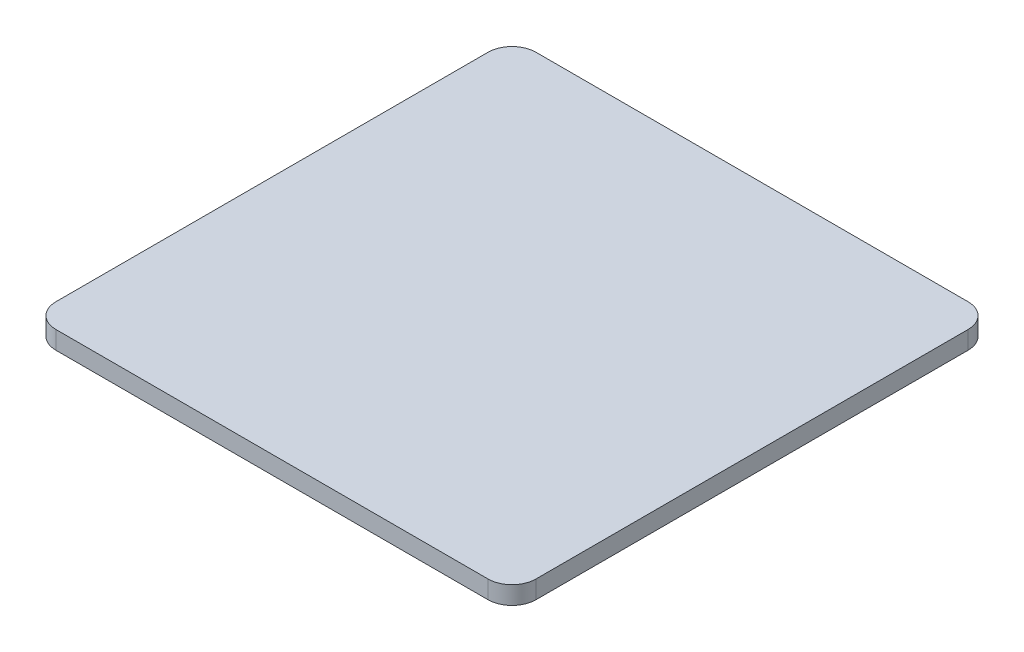
ISO-10303-21;
HEADER;
FILE_DESCRIPTION(('STEP AP214'),'2;1');
FILE_NAME('part.step','',(''),(''),'','','');
FILE_SCHEMA(('AUTOMOTIVE_DESIGN { 1 0 10303 214 1 1 1 1 }'));
ENDSEC;
DATA;
#1=APPLICATION_CONTEXT('core data for automotive mechanical design processes');
#2=APPLICATION_PROTOCOL_DEFINITION('international standard','automotive_design',2000,#1);
#3=PRODUCT_CONTEXT('',#1,'mechanical');
#4=PRODUCT('Part','Part','',(#3));
#5=PRODUCT_RELATED_PRODUCT_CATEGORY('part','',(#4));
#6=PRODUCT_DEFINITION_FORMATION('','',#4);
#7=PRODUCT_DEFINITION_CONTEXT('part definition',#1,'design');
#8=PRODUCT_DEFINITION('design','',#6,#7);
#9=PRODUCT_DEFINITION_SHAPE('','',#8);
#10=(LENGTH_UNIT() NAMED_UNIT(*) SI_UNIT(.MILLI.,.METRE.));
#11=(NAMED_UNIT(*) PLANE_ANGLE_UNIT() SI_UNIT($,.RADIAN.));
#12=(NAMED_UNIT(*) SI_UNIT($,.STERADIAN.) SOLID_ANGLE_UNIT());
#13=UNCERTAINTY_MEASURE_WITH_UNIT(LENGTH_MEASURE(1.E-05),#10,'distance_accuracy_value','');
#14=(GEOMETRIC_REPRESENTATION_CONTEXT(3) GLOBAL_UNCERTAINTY_ASSIGNED_CONTEXT((#13)) GLOBAL_UNIT_ASSIGNED_CONTEXT((#10,
#11,#12)) REPRESENTATION_CONTEXT('',''));
#15=CARTESIAN_POINT('',(0.,0.,0.));
#16=DIRECTION('',(0.,0.,1.));
#17=DIRECTION('',(1.,0.,0.));
#18=AXIS2_PLACEMENT_3D('',#15,#16,#17);
#19=CARTESIAN_POINT('',(40.,3.,-40.));
#20=DIRECTION('',(-1.,0.,0.));
#21=DIRECTION('',(0.,0.,1.));
#22=AXIS2_PLACEMENT_3D('',#19,#20,#21);
#23=PLANE('',#22);
#24=DIRECTION('',(0.,0.,-1.));
#25=VECTOR('',#24,1.);
#26=CARTESIAN_POINT('',(40.,0.,-40.));
#27=LINE('',#26,#25);
#28=CARTESIAN_POINT('',(40.,0.,36.));
#29=VERTEX_POINT('',#28);
#30=CARTESIAN_POINT('',(40.,0.,-36.));
#31=VERTEX_POINT('',#30);
#32=EDGE_CURVE('E143',#29,#31,#27,.T.);
#33=ORIENTED_EDGE('',*,*,#32,.T.);
#34=DIRECTION('',(0.,-1.,0.));
#35=VECTOR('',#34,1.);
#36=CARTESIAN_POINT('',(40.,3.,-36.));
#37=LINE('',#36,#35);
#38=CARTESIAN_POINT('',(40.,3.,-36.));
#39=VERTEX_POINT('',#38);
#40=EDGE_CURVE('E177',#31,#39,#37,.F.);
#41=ORIENTED_EDGE('',*,*,#40,.T.);
#42=DIRECTION('',(0.,0.,-1.));
#43=VECTOR('',#42,1.);
#44=CARTESIAN_POINT('',(40.,3.,-40.));
#45=LINE('',#44,#43);
#46=CARTESIAN_POINT('',(40.,3.,36.));
#47=VERTEX_POINT('',#46);
#48=EDGE_CURVE('E141',#47,#39,#45,.T.);
#49=ORIENTED_EDGE('',*,*,#48,.F.);
#50=DIRECTION('',(0.,-1.,0.));
#51=VECTOR('',#50,1.);
#52=CARTESIAN_POINT('',(40.,3.,36.));
#53=LINE('',#52,#51);
#54=EDGE_CURVE('E173',#47,#29,#53,.T.);
#55=ORIENTED_EDGE('',*,*,#54,.T.);
#56=EDGE_LOOP('',(#33,#41,#49,#55));
#57=FACE_BOUND('',#56,.T.);
#58=ADVANCED_FACE('F42',(#57),#23,.F.);
#59=CARTESIAN_POINT('',(-40.,3.,-40.));
#60=DIRECTION('',(0.,0.,1.));
#61=DIRECTION('',(1.,0.,0.));
#62=AXIS2_PLACEMENT_3D('',#59,#60,#61);
#63=PLANE('',#62);
#64=DIRECTION('',(-1.,0.,0.));
#65=VECTOR('',#64,1.);
#66=CARTESIAN_POINT('',(-40.,0.,-40.));
#67=LINE('',#66,#65);
#68=CARTESIAN_POINT('',(36.,0.,-40.));
#69=VERTEX_POINT('',#68);
#70=CARTESIAN_POINT('',(-36.,0.,-40.));
#71=VERTEX_POINT('',#70);
#72=EDGE_CURVE('E137',#69,#71,#67,.T.);
#73=ORIENTED_EDGE('',*,*,#72,.T.);
#74=DIRECTION('',(0.,-1.,0.));
#75=VECTOR('',#74,1.);
#76=CARTESIAN_POINT('',(-36.,3.,-40.));
#77=LINE('',#76,#75);
#78=CARTESIAN_POINT('',(-36.,3.,-40.));
#79=VERTEX_POINT('',#78);
#80=EDGE_CURVE('E113',#71,#79,#77,.F.);
#81=ORIENTED_EDGE('',*,*,#80,.T.);
#82=DIRECTION('',(-1.,0.,0.));
#83=VECTOR('',#82,1.);
#84=CARTESIAN_POINT('',(-40.,3.,-40.));
#85=LINE('',#84,#83);
#86=CARTESIAN_POINT('',(36.,3.,-40.));
#87=VERTEX_POINT('',#86);
#88=EDGE_CURVE('E196',#87,#79,#85,.T.);
#89=ORIENTED_EDGE('',*,*,#88,.F.);
#90=DIRECTION('',(0.,-1.,0.));
#91=VECTOR('',#90,1.);
#92=CARTESIAN_POINT('',(36.,3.,-40.));
#93=LINE('',#92,#91);
#94=EDGE_CURVE('E119',#87,#69,#93,.T.);
#95=ORIENTED_EDGE('',*,*,#94,.T.);
#96=EDGE_LOOP('',(#73,#81,#89,#95));
#97=FACE_BOUND('',#96,.T.);
#98=ADVANCED_FACE('F217',(#97),#63,.F.);
#99=CARTESIAN_POINT('',(-40.,3.,-40.));
#100=DIRECTION('',(1.,0.,0.));
#101=DIRECTION('',(0.,0.,-1.));
#102=AXIS2_PLACEMENT_3D('',#99,#100,#101);
#103=PLANE('',#102);
#104=DIRECTION('',(0.,0.,1.));
#105=VECTOR('',#104,1.);
#106=CARTESIAN_POINT('',(-40.,3.,-40.));
#107=LINE('',#106,#105);
#108=CARTESIAN_POINT('',(-40.,3.,-36.));
#109=VERTEX_POINT('',#108);
#110=CARTESIAN_POINT('',(-40.,3.,36.));
#111=VERTEX_POINT('',#110);
#112=EDGE_CURVE('E128',#109,#111,#107,.T.);
#113=ORIENTED_EDGE('',*,*,#112,.F.);
#114=DIRECTION('',(0.,-1.,0.));
#115=VECTOR('',#114,1.);
#116=CARTESIAN_POINT('',(-40.,3.,-36.));
#117=LINE('',#116,#115);
#118=CARTESIAN_POINT('',(-40.,0.,-36.));
#119=VERTEX_POINT('',#118);
#120=EDGE_CURVE('E112',#109,#119,#117,.T.);
#121=ORIENTED_EDGE('',*,*,#120,.T.);
#122=DIRECTION('',(0.,0.,1.));
#123=VECTOR('',#122,1.);
#124=CARTESIAN_POINT('',(-40.,0.,-40.));
#125=LINE('',#124,#123);
#126=CARTESIAN_POINT('',(-40.,0.,36.));
#127=VERTEX_POINT('',#126);
#128=EDGE_CURVE('E126',#119,#127,#125,.T.);
#129=ORIENTED_EDGE('',*,*,#128,.T.);
#130=DIRECTION('',(0.,-1.,0.));
#131=VECTOR('',#130,1.);
#132=CARTESIAN_POINT('',(-40.,3.,36.));
#133=LINE('',#132,#131);
#134=EDGE_CURVE('E131',#127,#111,#133,.F.);
#135=ORIENTED_EDGE('',*,*,#134,.T.);
#136=EDGE_LOOP('',(#113,#121,#129,#135));
#137=FACE_BOUND('',#136,.T.);
#138=ADVANCED_FACE('F125',(#137),#103,.F.);
#139=CARTESIAN_POINT('',(-40.,3.,40.));
#140=DIRECTION('',(0.,0.,-1.));
#141=DIRECTION('',(-1.,0.,0.));
#142=AXIS2_PLACEMENT_3D('',#139,#140,#141);
#143=PLANE('',#142);
#144=DIRECTION('',(1.,0.,0.));
#145=VECTOR('',#144,1.);
#146=CARTESIAN_POINT('',(-40.,0.,40.));
#147=LINE('',#146,#145);
#148=CARTESIAN_POINT('',(-36.,0.,40.));
#149=VERTEX_POINT('',#148);
#150=CARTESIAN_POINT('',(36.,0.,40.));
#151=VERTEX_POINT('',#150);
#152=EDGE_CURVE('E136',#149,#151,#147,.T.);
#153=ORIENTED_EDGE('',*,*,#152,.T.);
#154=DIRECTION('',(0.,-1.,0.));
#155=VECTOR('',#154,1.);
#156=CARTESIAN_POINT('',(36.,3.,40.));
#157=LINE('',#156,#155);
#158=CARTESIAN_POINT('',(36.,3.,40.));
#159=VERTEX_POINT('',#158);
#160=EDGE_CURVE('E11',#151,#159,#157,.F.);
#161=ORIENTED_EDGE('',*,*,#160,.T.);
#162=DIRECTION('',(1.,0.,0.));
#163=VECTOR('',#162,1.);
#164=CARTESIAN_POINT('',(-40.,3.,40.));
#165=LINE('',#164,#163);
#166=CARTESIAN_POINT('',(-36.,3.,40.));
#167=VERTEX_POINT('',#166);
#168=EDGE_CURVE('E148',#167,#159,#165,.T.);
#169=ORIENTED_EDGE('',*,*,#168,.F.);
#170=DIRECTION('',(0.,-1.,0.));
#171=VECTOR('',#170,1.);
#172=CARTESIAN_POINT('',(-36.,3.,40.));
#173=LINE('',#172,#171);
#174=EDGE_CURVE('E51',#167,#149,#173,.T.);
#175=ORIENTED_EDGE('',*,*,#174,.T.);
#176=EDGE_LOOP('',(#153,#161,#169,#175));
#177=FACE_BOUND('',#176,.T.);
#178=ADVANCED_FACE('F182',(#177),#143,.F.);
#179=CARTESIAN_POINT('',(0.,3.,0.));
#180=DIRECTION('',(0.,1.,0.));
#181=DIRECTION('',(0.,0.,1.));
#182=AXIS2_PLACEMENT_3D('',#179,#180,#181);
#183=PLANE('',#182);
#184=ORIENTED_EDGE('',*,*,#88,.T.);
#185=CARTESIAN_POINT('',(-36.,3.,-36.));
#186=DIRECTION('',(0.,1.,0.));
#187=DIRECTION('',(0.,0.,1.));
#188=AXIS2_PLACEMENT_3D('',#185,#186,#187);
#189=CIRCLE('',#188,4.);
#190=EDGE_CURVE('E170',#79,#109,#189,.T.);
#191=ORIENTED_EDGE('',*,*,#190,.T.);
#192=ORIENTED_EDGE('',*,*,#112,.T.);
#193=CARTESIAN_POINT('',(-36.,3.,36.));
#194=DIRECTION('',(0.,1.,0.));
#195=DIRECTION('',(0.,0.,1.));
#196=AXIS2_PLACEMENT_3D('',#193,#194,#195);
#197=CIRCLE('',#196,4.);
#198=EDGE_CURVE('E63',#111,#167,#197,.T.);
#199=ORIENTED_EDGE('',*,*,#198,.T.);
#200=ORIENTED_EDGE('',*,*,#168,.T.);
#201=CARTESIAN_POINT('',(36.,3.,36.));
#202=DIRECTION('',(0.,1.,0.));
#203=DIRECTION('',(0.,0.,1.));
#204=AXIS2_PLACEMENT_3D('',#201,#202,#203);
#205=CIRCLE('',#204,4.);
#206=EDGE_CURVE('E164',#159,#47,#205,.T.);
#207=ORIENTED_EDGE('',*,*,#206,.T.);
#208=ORIENTED_EDGE('',*,*,#48,.T.);
#209=CARTESIAN_POINT('',(36.,3.,-36.));
#210=DIRECTION('',(0.,1.,0.));
#211=DIRECTION('',(0.,0.,1.));
#212=AXIS2_PLACEMENT_3D('',#209,#210,#211);
#213=CIRCLE('',#212,4.);
#214=EDGE_CURVE('E167',#39,#87,#213,.T.);
#215=ORIENTED_EDGE('',*,*,#214,.T.);
#216=EDGE_LOOP('',(#184,#191,#192,#199,#200,#207,#208,#215));
#217=FACE_BOUND('',#216,.T.);
#218=ADVANCED_FACE('F206',(#217),#183,.T.);
#219=CARTESIAN_POINT('',(0.,0.,0.));
#220=DIRECTION('',(0.,1.,0.));
#221=DIRECTION('',(0.,0.,1.));
#222=AXIS2_PLACEMENT_3D('',#219,#220,#221);
#223=PLANE('',#222);
#224=ORIENTED_EDGE('',*,*,#128,.F.);
#225=CARTESIAN_POINT('',(-36.,0.,-36.));
#226=DIRECTION('',(0.,1.,0.));
#227=DIRECTION('',(0.,0.,1.));
#228=AXIS2_PLACEMENT_3D('',#225,#226,#227);
#229=CIRCLE('',#228,4.);
#230=EDGE_CURVE('E108',#119,#71,#229,.F.);
#231=ORIENTED_EDGE('',*,*,#230,.T.);
#232=ORIENTED_EDGE('',*,*,#72,.F.);
#233=CARTESIAN_POINT('',(36.,0.,-36.));
#234=DIRECTION('',(0.,1.,0.));
#235=DIRECTION('',(0.,0.,1.));
#236=AXIS2_PLACEMENT_3D('',#233,#234,#235);
#237=CIRCLE('',#236,4.);
#238=EDGE_CURVE('E120',#69,#31,#237,.F.);
#239=ORIENTED_EDGE('',*,*,#238,.T.);
#240=ORIENTED_EDGE('',*,*,#32,.F.);
#241=CARTESIAN_POINT('',(36.,0.,36.));
#242=DIRECTION('',(0.,1.,0.));
#243=DIRECTION('',(0.,0.,1.));
#244=AXIS2_PLACEMENT_3D('',#241,#242,#243);
#245=CIRCLE('',#244,4.);
#246=EDGE_CURVE('E152',#29,#151,#245,.F.);
#247=ORIENTED_EDGE('',*,*,#246,.T.);
#248=ORIENTED_EDGE('',*,*,#152,.F.);
#249=CARTESIAN_POINT('',(-36.,0.,36.));
#250=DIRECTION('',(0.,1.,0.));
#251=DIRECTION('',(0.,0.,1.));
#252=AXIS2_PLACEMENT_3D('',#249,#250,#251);
#253=CIRCLE('',#252,4.);
#254=EDGE_CURVE('E130',#149,#127,#253,.F.);
#255=ORIENTED_EDGE('',*,*,#254,.T.);
#256=EDGE_LOOP('',(#224,#231,#232,#239,#240,#247,#248,#255));
#257=FACE_BOUND('',#256,.T.);
#258=ADVANCED_FACE('F133',(#257),#223,.F.);
#259=CARTESIAN_POINT('',(-36.,3.,-36.));
#260=DIRECTION('',(0.,-1.,0.));
#261=DIRECTION('',(0.,0.,-1.));
#262=AXIS2_PLACEMENT_3D('',#259,#260,#261);
#263=CYLINDRICAL_SURFACE('',#262,4.);
#264=ORIENTED_EDGE('',*,*,#190,.F.);
#265=ORIENTED_EDGE('',*,*,#80,.F.);
#266=ORIENTED_EDGE('',*,*,#230,.F.);
#267=ORIENTED_EDGE('',*,*,#120,.F.);
#268=EDGE_LOOP('',(#264,#265,#266,#267));
#269=FACE_BOUND('',#268,.T.);
#270=ADVANCED_FACE('F111',(#269),#263,.T.);
#271=CARTESIAN_POINT('',(36.,3.,-36.));
#272=DIRECTION('',(0.,-1.,0.));
#273=DIRECTION('',(0.,0.,-1.));
#274=AXIS2_PLACEMENT_3D('',#271,#272,#273);
#275=CYLINDRICAL_SURFACE('',#274,4.);
#276=ORIENTED_EDGE('',*,*,#214,.F.);
#277=ORIENTED_EDGE('',*,*,#40,.F.);
#278=ORIENTED_EDGE('',*,*,#238,.F.);
#279=ORIENTED_EDGE('',*,*,#94,.F.);
#280=EDGE_LOOP('',(#276,#277,#278,#279));
#281=FACE_BOUND('',#280,.T.);
#282=ADVANCED_FACE('F228',(#281),#275,.T.);
#283=CARTESIAN_POINT('',(36.,3.,36.));
#284=DIRECTION('',(0.,-1.,0.));
#285=DIRECTION('',(0.,0.,-1.));
#286=AXIS2_PLACEMENT_3D('',#283,#284,#285);
#287=CYLINDRICAL_SURFACE('',#286,4.);
#288=ORIENTED_EDGE('',*,*,#206,.F.);
#289=ORIENTED_EDGE('',*,*,#160,.F.);
#290=ORIENTED_EDGE('',*,*,#246,.F.);
#291=ORIENTED_EDGE('',*,*,#54,.F.);
#292=EDGE_LOOP('',(#288,#289,#290,#291));
#293=FACE_BOUND('',#292,.T.);
#294=ADVANCED_FACE('F189',(#293),#287,.T.);
#295=CARTESIAN_POINT('',(-36.,3.,36.));
#296=DIRECTION('',(0.,-1.,0.));
#297=DIRECTION('',(0.,0.,-1.));
#298=AXIS2_PLACEMENT_3D('',#295,#296,#297);
#299=CYLINDRICAL_SURFACE('',#298,4.);
#300=ORIENTED_EDGE('',*,*,#198,.F.);
#301=ORIENTED_EDGE('',*,*,#134,.F.);
#302=ORIENTED_EDGE('',*,*,#254,.F.);
#303=ORIENTED_EDGE('',*,*,#174,.F.);
#304=EDGE_LOOP('',(#300,#301,#302,#303));
#305=FACE_BOUND('',#304,.T.);
#306=ADVANCED_FACE('F44',(#305),#299,.T.);
#307=CLOSED_SHELL('',(#58,#98,#138,#178,#218,#258,#270,#282,#294,#306));
#308=MANIFOLD_SOLID_BREP('B2',#307);
#309=ADVANCED_BREP_SHAPE_REPRESENTATION('',(#18,#308),#14);
#310=SHAPE_DEFINITION_REPRESENTATION(#9,#309);
ENDSEC;
END-ISO-10303-21;
